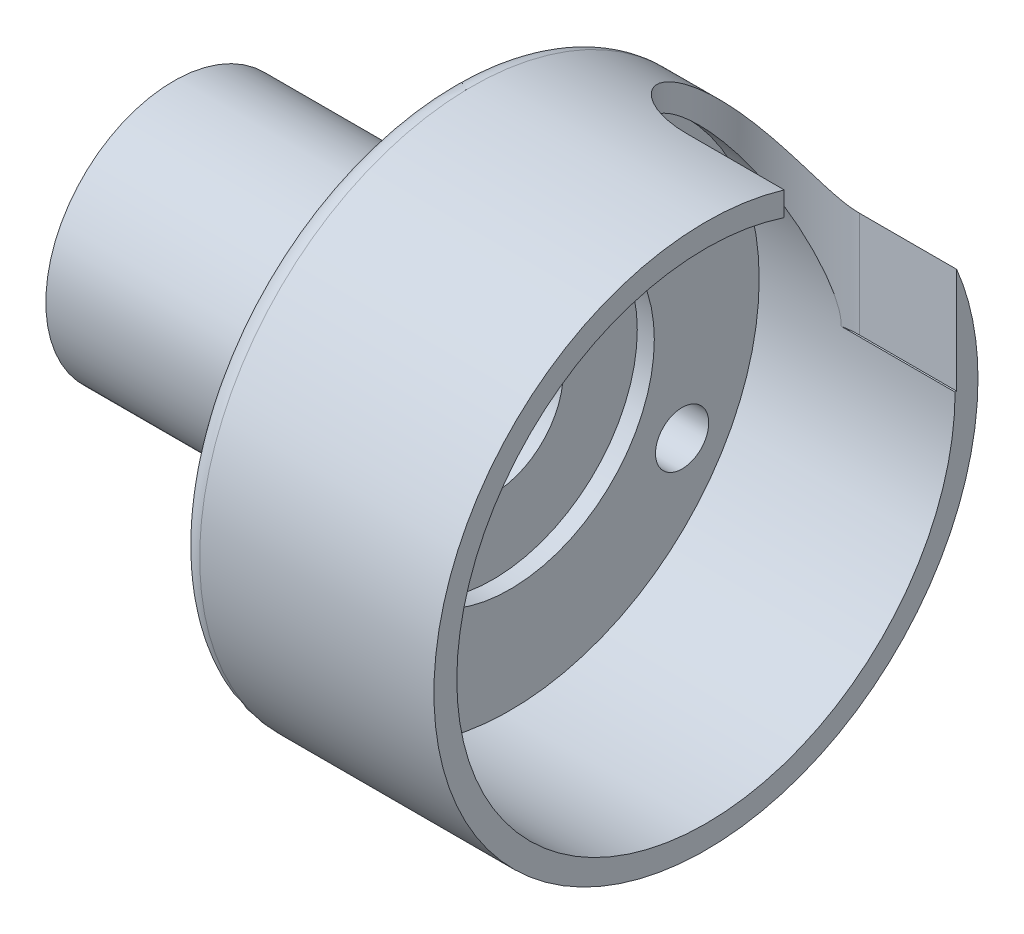
ISO-10303-21;
HEADER;
FILE_DESCRIPTION(('STEP AP214'),'2;1');
FILE_NAME('part.step','',(''),(''),'','','');
FILE_SCHEMA(('AUTOMOTIVE_DESIGN { 1 0 10303 214 1 1 1 1 }'));
ENDSEC;
DATA;
#1=APPLICATION_CONTEXT('core data for automotive mechanical design processes');
#2=APPLICATION_PROTOCOL_DEFINITION('international standard','automotive_design',2000,#1);
#3=PRODUCT_CONTEXT('',#1,'mechanical');
#4=PRODUCT('Part','Part','',(#3));
#5=PRODUCT_RELATED_PRODUCT_CATEGORY('part','',(#4));
#6=PRODUCT_DEFINITION_FORMATION('','',#4);
#7=PRODUCT_DEFINITION_CONTEXT('part definition',#1,'design');
#8=PRODUCT_DEFINITION('design','',#6,#7);
#9=PRODUCT_DEFINITION_SHAPE('','',#8);
#10=(LENGTH_UNIT() NAMED_UNIT(*) SI_UNIT(.MILLI.,.METRE.));
#11=(NAMED_UNIT(*) PLANE_ANGLE_UNIT() SI_UNIT($,.RADIAN.));
#12=(NAMED_UNIT(*) SI_UNIT($,.STERADIAN.) SOLID_ANGLE_UNIT());
#13=UNCERTAINTY_MEASURE_WITH_UNIT(LENGTH_MEASURE(1.E-05),#10,'distance_accuracy_value','');
#14=(GEOMETRIC_REPRESENTATION_CONTEXT(3) GLOBAL_UNCERTAINTY_ASSIGNED_CONTEXT((#13)) GLOBAL_UNIT_ASSIGNED_CONTEXT((#10,
#11,#12)) REPRESENTATION_CONTEXT('',''));
#15=CARTESIAN_POINT('',(0.,0.,0.));
#16=DIRECTION('',(0.,0.,1.));
#17=DIRECTION('',(1.,0.,0.));
#18=AXIS2_PLACEMENT_3D('',#15,#16,#17);
#19=CARTESIAN_POINT('',(-5.,0.,0.));
#20=DIRECTION('',(1.,0.,0.));
#21=DIRECTION('',(0.,0.,-1.));
#22=AXIS2_PLACEMENT_3D('',#19,#20,#21);
#23=CYLINDRICAL_SURFACE('',#22,3.3);
#24=CARTESIAN_POINT('',(10.,0.,0.));
#25=DIRECTION('',(1.,0.,0.));
#26=DIRECTION('',(0.,0.,-1.));
#27=AXIS2_PLACEMENT_3D('',#24,#25,#26);
#28=CIRCLE('',#27,3.3);
#29=CARTESIAN_POINT('',(10.,0.,-3.3));
#30=VERTEX_POINT('',#29);
#31=EDGE_CURVE('E255',#30,#30,#28,.T.);
#32=ORIENTED_EDGE('',*,*,#31,.T.);
#33=EDGE_LOOP('',(#32));
#34=FACE_BOUND('',#33,.T.);
#35=CARTESIAN_POINT('',(9.00000000000001,0.,0.));
#36=DIRECTION('',(-1.,0.,0.));
#37=DIRECTION('',(0.,0.,1.));
#38=AXIS2_PLACEMENT_3D('',#35,#36,#37);
#39=CIRCLE('',#38,3.3);
#40=CARTESIAN_POINT('',(9.00000000000001,0.,3.3));
#41=VERTEX_POINT('',#40);
#42=EDGE_CURVE('E69',#41,#41,#39,.F.);
#43=ORIENTED_EDGE('',*,*,#42,.F.);
#44=EDGE_LOOP('',(#43));
#45=FACE_BOUND('',#44,.T.);
#46=ADVANCED_FACE('F65',(#34,#45),#23,.F.);
#47=CARTESIAN_POINT('',(20.,0.,0.));
#48=DIRECTION('',(1.,0.,0.));
#49=DIRECTION('',(0.,0.,-1.));
#50=AXIS2_PLACEMENT_3D('',#47,#48,#49);
#51=PLANE('',#50);
#52=CARTESIAN_POINT('',(20.,0.,0.));
#53=DIRECTION('',(1.,0.,0.));
#54=DIRECTION('',(0.,0.,-1.));
#55=AXIS2_PLACEMENT_3D('',#52,#53,#54);
#56=CIRCLE('',#55,11.7);
#57=CARTESIAN_POINT('',(20.,11.1078519525604,-3.675));
#58=VERTEX_POINT('',#57);
#59=CARTESIAN_POINT('',(20.,0.,-11.7));
#60=VERTEX_POINT('',#59);
#61=EDGE_CURVE('E460',#58,#60,#56,.T.);
#62=ORIENTED_EDGE('',*,*,#61,.F.);
#63=DIRECTION('',(0.,-1.,0.));
#64=VECTOR('',#63,1.);
#65=CARTESIAN_POINT('',(20.,16.,-3.675));
#66=LINE('',#65,#64);
#67=CARTESIAN_POINT('',(20.,12.234990805064,-3.675));
#68=VERTEX_POINT('',#67);
#69=EDGE_CURVE('E135',#68,#58,#66,.T.);
#70=ORIENTED_EDGE('',*,*,#69,.F.);
#71=CARTESIAN_POINT('',(20.,0.,0.));
#72=DIRECTION('',(1.,0.,0.));
#73=DIRECTION('',(0.,0.,-1.));
#74=AXIS2_PLACEMENT_3D('',#71,#72,#73);
#75=CIRCLE('',#74,12.775);
#76=CARTESIAN_POINT('',(20.,4.954795656735,-11.775));
#77=VERTEX_POINT('',#76);
#78=EDGE_CURVE('E133',#68,#77,#75,.T.);
#79=ORIENTED_EDGE('',*,*,#78,.T.);
#80=DIRECTION('',(0.,-1.,0.));
#81=VECTOR('',#80,1.);
#82=CARTESIAN_POINT('',(20.,16.,-11.775));
#83=LINE('',#82,#81);
#84=CARTESIAN_POINT('',(20.,0.,-11.775));
#85=VERTEX_POINT('',#84);
#86=EDGE_CURVE('E125',#77,#85,#83,.T.);
#87=ORIENTED_EDGE('',*,*,#86,.T.);
#88=DIRECTION('',(0.,0.,1.));
#89=VECTOR('',#88,1.);
#90=CARTESIAN_POINT('',(20.,0.,-11.775));
#91=LINE('',#90,#89);
#92=EDGE_CURVE('E112',#85,#60,#91,.T.);
#93=ORIENTED_EDGE('',*,*,#92,.T.);
#94=EDGE_LOOP('',(#62,#70,#79,#87,#93));
#95=FACE_BOUND('',#94,.T.);
#96=ADVANCED_FACE('F130',(#95),#51,.T.);
#97=CARTESIAN_POINT('',(-22.2925973595304,0.,0.));
#98=DIRECTION('',(1.,0.,0.));
#99=DIRECTION('',(0.,0.,-1.));
#100=AXIS2_PLACEMENT_3D('',#97,#98,#99);
#101=CYLINDRICAL_SURFACE('',#100,11.7);
#102=CARTESIAN_POINT('',(10.8,0.,0.));
#103=DIRECTION('',(1.,0.,0.));
#104=DIRECTION('',(0.,0.,-1.));
#105=AXIS2_PLACEMENT_3D('',#102,#103,#104);
#106=CIRCLE('',#105,11.7);
#107=CARTESIAN_POINT('',(10.8,0.,-11.7));
#108=VERTEX_POINT('',#107);
#109=EDGE_CURVE('E462',#108,#108,#106,.F.);
#110=ORIENTED_EDGE('',*,*,#109,.T.);
#111=EDGE_LOOP('',(#110));
#112=FACE_BOUND('',#111,.T.);
#113=DIRECTION('',(1.,0.,0.));
#114=VECTOR('',#113,1.);
#115=CARTESIAN_POINT('',(-22.2925973595304,11.1078519525604,-3.675));
#116=LINE('',#115,#114);
#117=CARTESIAN_POINT('',(15.4300719305149,11.1078519525604,-3.675));
#118=VERTEX_POINT('',#117);
#119=EDGE_CURVE('E12',#58,#118,#116,.F.);
#120=ORIENTED_EDGE('',*,*,#119,.F.);
#121=ORIENTED_EDGE('',*,*,#61,.T.);
#122=DIRECTION('',(1.,0.,0.));
#123=VECTOR('',#122,1.);
#124=CARTESIAN_POINT('',(-22.2925973595304,0.,-11.7));
#125=LINE('',#124,#123);
#126=CARTESIAN_POINT('',(14.6542658980557,0.,-11.7));
#127=VERTEX_POINT('',#126);
#128=EDGE_CURVE('E117',#127,#60,#125,.T.);
#129=ORIENTED_EDGE('',*,*,#128,.F.);
#130=CARTESIAN_POINT('',(15.4300719305149,11.1078519525604,-3.675));
#131=CARTESIAN_POINT('',(15.321874357469,11.1078448137557,-3.67498552687792));
#132=CARTESIAN_POINT('',(15.2136782804234,11.1064172853442,-3.67933520948674));
#133=CARTESIAN_POINT('',(14.9980606494924,11.1006696657326,-3.69665890445622));
#134=CARTESIAN_POINT('',(14.8906390620478,11.0963497006348,-3.70963254083601));
#135=CARTESIAN_POINT('',(14.6774242912556,11.0847704243369,-3.74408532582627));
#136=CARTESIAN_POINT('',(14.5716297842871,11.0775136495638,-3.76555713449037));
#137=CARTESIAN_POINT('',(14.3623289609946,11.0599628707838,-3.81679957797082));
#138=CARTESIAN_POINT('',(14.2588226097493,11.049668913164,-3.84657008604012));
#139=CARTESIAN_POINT('',(14.0547931684851,11.0259147585262,-3.91413900220891));
#140=CARTESIAN_POINT('',(13.9542712375576,11.0124533489881,-3.95194048407501));
#141=CARTESIAN_POINT('',(13.7569264810491,10.9822151758271,-4.0352089751864));
#142=CARTESIAN_POINT('',(13.6601050264642,10.965437197383,-4.08067879235641));
#143=CARTESIAN_POINT('',(13.4709421983971,10.9284269946721,-4.17878309954883));
#144=CARTESIAN_POINT('',(13.3785976941289,10.9081972303655,-4.23141248183622));
#145=CARTESIAN_POINT('',(13.1989062753842,10.8641149774511,-4.34334239082116));
#146=CARTESIAN_POINT('',(13.1115612094694,10.8402611605978,-4.40264536136992));
#147=CARTESIAN_POINT('',(12.9423726209153,10.7887708307644,-4.52735884454252));
#148=CARTESIAN_POINT('',(12.8605353188507,10.7611301442932,-4.59277607002198));
#149=CARTESIAN_POINT('',(12.7029250624789,10.7019664310599,-4.72899872870154));
#150=CARTESIAN_POINT('',(12.6271543043419,10.6704420087244,-4.79980609527089));
#151=CARTESIAN_POINT('',(12.482118970827,10.6034547126697,-4.94602985375144));
#152=CARTESIAN_POINT('',(12.4128529538663,10.5679927154171,-5.02144521829218));
#153=CARTESIAN_POINT('',(12.2810741934953,10.4930870709412,-5.17614852903445));
#154=CARTESIAN_POINT('',(12.2185639855313,10.4536419395217,-5.25543791305136));
#155=CARTESIAN_POINT('',(12.0988340776575,10.3696272488956,-5.41936730125553));
#156=CARTESIAN_POINT('',(12.0418142838359,10.3249442200007,-5.50409523771966));
#157=CARTESIAN_POINT('',(11.9352006229624,10.231481696717,-5.67594740760889));
#158=CARTESIAN_POINT('',(11.8856094577103,10.1827007219203,-5.76307249931097));
#159=CARTESIAN_POINT('',(11.7479919389348,10.0304128845363,-6.02675993975707));
#160=CARTESIAN_POINT('',(11.6710341065358,9.92089946784347,-6.20575651932947));
#161=CARTESIAN_POINT('',(11.53921610847,9.67611794763069,-6.58163404240134));
#162=CARTESIAN_POINT('',(11.4872578914085,9.53937796679476,-6.7785498304953));
#163=CARTESIAN_POINT('',(11.4138077394232,9.25101562171613,-7.16709855321967));
#164=CARTESIAN_POINT('',(11.3923345402653,9.09938416647827,-7.35872816815356));
#165=CARTESIAN_POINT('',(11.3776043255917,8.81910089336532,-7.69088323482363));
#166=CARTESIAN_POINT('',(11.379124453972,8.69286147619829,-7.83327815203036));
#167=CARTESIAN_POINT('',(11.3961354997653,8.43398843227,-8.11134514872891));
#168=CARTESIAN_POINT('',(11.411632545795,8.30135202469889,-8.24701425154406));
#169=CARTESIAN_POINT('',(11.4548337419917,8.03040139340595,-8.5110832104586));
#170=CARTESIAN_POINT('',(11.4825651007312,7.89207514101251,-8.63946614007853));
#171=CARTESIAN_POINT('',(11.5485755572088,7.61085413971097,-8.88820294958323));
#172=CARTESIAN_POINT('',(11.5868545588686,7.46795943242737,-9.0085569025915));
#173=CARTESIAN_POINT('',(11.6922648875331,7.11135313798653,-9.2947484208774));
#174=CARTESIAN_POINT('',(11.7645568598733,6.89541200487178,-9.4559236479076));
#175=CARTESIAN_POINT('',(11.9246003485401,6.45688903981087,-9.76063319470439));
#176=CARTESIAN_POINT('',(12.0123595813919,6.23430393948547,-9.90415864813986));
#177=CARTESIAN_POINT('',(12.2000435751838,5.78391399409746,-10.1737505484756));
#178=CARTESIAN_POINT('',(12.2999647888715,5.55611068667703,-10.2998220632982));
#179=CARTESIAN_POINT('',(12.5092163718453,5.09621124956749,-10.534957449911));
#180=CARTESIAN_POINT('',(12.6185446722719,4.86411607254096,-10.6440250465372));
#181=CARTESIAN_POINT('',(12.8277125089724,4.43033637143341,-10.8309495438246));
#182=CARTESIAN_POINT('',(12.9266114998205,4.22915167930686,-10.9110384456941));
#183=CARTESIAN_POINT('',(13.1280007184286,3.82425218293121,-11.0594573665479));
#184=CARTESIAN_POINT('',(13.2304911087491,3.62053726442442,-11.1277868524259));
#185=CARTESIAN_POINT('',(13.4377113527418,3.2098726704605,-11.2531313742553));
#186=CARTESIAN_POINT('',(13.5424475670153,3.00291443440759,-11.3101076747649));
#187=CARTESIAN_POINT('',(13.751580027422,2.58608148099421,-11.412636979699));
#188=CARTESIAN_POINT('',(13.8559763679308,2.37620767713658,-11.458193480607));
#189=CARTESIAN_POINT('',(14.0163476692944,2.04379096285069,-11.5207603221632));
#190=CARTESIAN_POINT('',(14.0737703418485,1.92266038120232,-11.5416039116953));
#191=CARTESIAN_POINT('',(14.1859228431972,1.67859844764865,-11.5796186953345));
#192=CARTESIAN_POINT('',(14.2406531601851,1.55566742749431,-11.5967905571242));
#193=CARTESIAN_POINT('',(14.3448221704693,1.30849268850074,-11.6272613762697));
#194=CARTESIAN_POINT('',(14.3943068691404,1.18427311777827,-11.6405961397017));
#195=CARTESIAN_POINT('',(14.4849762527032,0.932561413433722,-11.6634595495844));
#196=CARTESIAN_POINT('',(14.5261714410956,0.805073654890283,-11.6729930278154));
#197=CARTESIAN_POINT('',(14.5889900223494,0.565989043937799,-11.6868145682267));
#198=CARTESIAN_POINT('',(14.612659380525,0.454999146570424,-11.6916873191988));
#199=CARTESIAN_POINT('',(14.6371821680639,0.286193464371981,-11.6966367778539));
#200=CARTESIAN_POINT('',(14.6435303246998,0.2292114866861,-11.6978935986054));
#201=CARTESIAN_POINT('',(14.6520978220564,0.114830471088762,-11.6995771020297));
#202=CARTESIAN_POINT('',(14.6543099801694,0.057430881106254,-11.7000023406291));
#203=CARTESIAN_POINT('',(14.6542658980557,0.,-11.7));
#204=B_SPLINE_CURVE_WITH_KNOTS('',3,(#130,#131,#132,#133,#134,#135,#136,#137,#138,#139,#140,
#141,#142,#143,#144,#145,#146,#147,#148,#149,#150,#151,#152,#153,#154,#155,#156,#157,#158,#159,
#160,#161,#162,#163,#164,#165,#166,#167,#168,#169,#170,#171,#172,#173,#174,#175,#176,#177,#178,
#179,#180,#181,#182,#183,#184,#185,#186,#187,#188,#189,#190,#191,#192,#193,#194,#195,#196,#197,
#198,#199,#200,#201,#202,#203),.UNSPECIFIED.,.F.,.F.,(4,2,2,2,2,2,2,2,2,2,2,2,2,2,2,2,2,2,2,2,2,
2,2,2,2,2,2,2,2,2,2,2,2,2,2,2,4),(0.,0.324493843286334,0.648973540454027,0.973173591110084,
1.29736869049004,1.62168809622833,1.94612651732118,2.27033468156188,2.59466195874875,
2.91934959476239,3.24415424553152,3.56888674227139,3.89374069055089,4.22779245409338,
4.56196541914957,5.22982968361078,5.96309567763883,6.69681213430079,7.26696933938862,
7.83737666934317,8.40905900564491,8.98073613466804,9.81641443947229,10.6525108455413,
11.4883639713546,12.3240337391983,13.0378648856676,13.751728384734,14.4679872805049,
15.1840266054581,15.5909520047519,15.9978033439639,16.4007249333238,16.8031327273289,
17.1430457162478,17.3149437241322,17.4871399751646),.UNSPECIFIED.);
#205=EDGE_CURVE('E75',#118,#127,#204,.T.);
#206=ORIENTED_EDGE('',*,*,#205,.F.);
#207=EDGE_LOOP('',(#120,#121,#129,#206));
#208=FACE_BOUND('',#207,.T.);
#209=ADVANCED_FACE('F182',(#112,#208),#101,.F.);
#210=CARTESIAN_POINT('',(10.,0.,0.));
#211=DIRECTION('',(1.,0.,0.));
#212=DIRECTION('',(0.,0.,-1.));
#213=AXIS2_PLACEMENT_3D('',#210,#211,#212);
#214=PLANE('',#213);
#215=ORIENTED_EDGE('',*,*,#31,.F.);
#216=EDGE_LOOP('',(#215));
#217=FACE_BOUND('',#216,.T.);
#218=CARTESIAN_POINT('',(10.,0.,0.));
#219=DIRECTION('',(1.,0.,0.));
#220=DIRECTION('',(0.,0.,-1.));
#221=AXIS2_PLACEMENT_3D('',#218,#219,#220);
#222=CIRCLE('',#221,6.775);
#223=CARTESIAN_POINT('',(10.,0.,-6.775));
#224=VERTEX_POINT('',#223);
#225=EDGE_CURVE('E262',#224,#224,#222,.T.);
#226=ORIENTED_EDGE('',*,*,#225,.T.);
#227=EDGE_LOOP('',(#226));
#228=FACE_BOUND('',#227,.T.);
#229=ADVANCED_FACE('F186',(#217,#228),#214,.T.);
#230=CARTESIAN_POINT('',(-5.,0.,0.));
#231=DIRECTION('',(1.,0.,0.));
#232=DIRECTION('',(0.,0.,-1.));
#233=AXIS2_PLACEMENT_3D('',#230,#231,#232);
#234=CYLINDRICAL_SURFACE('',#233,6.);
#235=CARTESIAN_POINT('',(-5.,0.,0.));
#236=DIRECTION('',(1.,0.,0.));
#237=DIRECTION('',(0.,0.,-1.));
#238=AXIS2_PLACEMENT_3D('',#235,#236,#237);
#239=CIRCLE('',#238,6.);
#240=CARTESIAN_POINT('',(-5.,0.,-6.));
#241=VERTEX_POINT('',#240);
#242=EDGE_CURVE('E249',#241,#241,#239,.T.);
#243=ORIENTED_EDGE('',*,*,#242,.T.);
#244=EDGE_LOOP('',(#243));
#245=FACE_BOUND('',#244,.T.);
#246=CARTESIAN_POINT('',(8.,0.,0.));
#247=DIRECTION('',(1.,0.,0.));
#248=DIRECTION('',(0.,0.,-1.));
#249=AXIS2_PLACEMENT_3D('',#246,#247,#248);
#250=CIRCLE('',#249,6.);
#251=CARTESIAN_POINT('',(8.,0.,-6.));
#252=VERTEX_POINT('',#251);
#253=EDGE_CURVE('E252',#252,#252,#250,.F.);
#254=ORIENTED_EDGE('',*,*,#253,.T.);
#255=EDGE_LOOP('',(#254));
#256=FACE_BOUND('',#255,.T.);
#257=ADVANCED_FACE('F238',(#245,#256),#234,.T.);
#258=CARTESIAN_POINT('',(-5.,0.,0.));
#259=DIRECTION('',(1.,0.,0.));
#260=DIRECTION('',(0.,0.,-1.));
#261=AXIS2_PLACEMENT_3D('',#258,#259,#260);
#262=PLANE('',#261);
#263=CARTESIAN_POINT('',(-5.,0.,0.));
#264=DIRECTION('',(-1.,0.,0.));
#265=DIRECTION('',(0.,0.,1.));
#266=AXIS2_PLACEMENT_3D('',#263,#264,#265);
#267=CIRCLE('',#266,4.5);
#268=CARTESIAN_POINT('',(-5.,0.,4.5));
#269=VERTEX_POINT('',#268);
#270=EDGE_CURVE('E447',#269,#269,#267,.T.);
#271=ORIENTED_EDGE('',*,*,#270,.F.);
#272=EDGE_LOOP('',(#271));
#273=FACE_BOUND('',#272,.T.);
#274=ORIENTED_EDGE('',*,*,#242,.F.);
#275=EDGE_LOOP('',(#274));
#276=FACE_BOUND('',#275,.T.);
#277=ADVANCED_FACE('F236',(#273,#276),#262,.F.);
#278=CARTESIAN_POINT('',(8.,0.,0.));
#279=DIRECTION('',(1.,0.,0.));
#280=DIRECTION('',(0.,0.,-1.));
#281=AXIS2_PLACEMENT_3D('',#278,#279,#280);
#282=PLANE('',#281);
#283=CARTESIAN_POINT('',(8.,0.,0.));
#284=DIRECTION('',(1.,0.,0.));
#285=DIRECTION('',(0.,0.,-1.));
#286=AXIS2_PLACEMENT_3D('',#283,#284,#285);
#287=CIRCLE('',#286,11.775);
#288=CARTESIAN_POINT('',(8.,0.,-11.775));
#289=VERTEX_POINT('',#288);
#290=EDGE_CURVE('E271',#289,#289,#287,.F.);
#291=ORIENTED_EDGE('',*,*,#290,.T.);
#292=EDGE_LOOP('',(#291));
#293=FACE_BOUND('',#292,.T.);
#294=ORIENTED_EDGE('',*,*,#253,.F.);
#295=EDGE_LOOP('',(#294));
#296=FACE_BOUND('',#295,.T.);
#297=ADVANCED_FACE('F223',(#293,#296),#282,.F.);
#298=CARTESIAN_POINT('',(8.,0.,0.));
#299=DIRECTION('',(1.,0.,0.));
#300=DIRECTION('',(0.,0.,-1.));
#301=AXIS2_PLACEMENT_3D('',#298,#299,#300);
#302=CYLINDRICAL_SURFACE('',#301,12.775);
#303=DIRECTION('',(1.,0.,0.));
#304=VECTOR('',#303,1.);
#305=CARTESIAN_POINT('',(8.00000000000001,4.95479565673499,-11.775));
#306=LINE('',#305,#304);
#307=CARTESIAN_POINT('',(15.4300719305149,4.954795656735,-11.775));
#308=VERTEX_POINT('',#307);
#309=EDGE_CURVE('E90',#77,#308,#306,.F.);
#310=ORIENTED_EDGE('',*,*,#309,.F.);
#311=ORIENTED_EDGE('',*,*,#78,.F.);
#312=DIRECTION('',(1.,0.,0.));
#313=VECTOR('',#312,1.);
#314=CARTESIAN_POINT('',(8.,12.234990805064,-3.675));
#315=LINE('',#314,#313);
#316=CARTESIAN_POINT('',(15.4300719305149,12.234990805064,-3.675));
#317=VERTEX_POINT('',#316);
#318=EDGE_CURVE('E144',#68,#317,#315,.F.);
#319=ORIENTED_EDGE('',*,*,#318,.T.);
#320=CARTESIAN_POINT('',(15.4300719305149,12.234990805064,-3.675));
#321=CARTESIAN_POINT('',(15.3209331471853,12.234984045307,-3.67498583358514));
#322=CARTESIAN_POINT('',(15.2117959017638,12.2336655392509,-3.67941098492061));
#323=CARTESIAN_POINT('',(14.9943026022523,12.2283560286608,-3.6970380817084));
#324=CARTESIAN_POINT('',(14.8859465137105,12.2243651427261,-3.71023963766665));
#325=CARTESIAN_POINT('',(14.6708744450499,12.2136663827676,-3.74530294439951));
#326=CARTESIAN_POINT('',(14.5641571602142,12.2069608003351,-3.76715739055855));
#327=CARTESIAN_POINT('',(14.3530300604128,12.1907398060429,-3.81932434510254));
#328=CARTESIAN_POINT('',(14.2486202113645,12.1812244357158,-3.84963672846712));
#329=CARTESIAN_POINT('',(14.0428106007343,12.1592613741932,-3.91845509230125));
#330=CARTESIAN_POINT('',(13.9414119614849,12.1468126047366,-3.95696408518206));
#331=CARTESIAN_POINT('',(13.7423456042829,12.1188400980153,-4.04182325481384));
#332=CARTESIAN_POINT('',(13.6446792702618,12.1033152330875,-4.08817630619919));
#333=CARTESIAN_POINT('',(13.4538650465589,12.0690555467578,-4.18823540936472));
#334=CARTESIAN_POINT('',(13.360714098302,12.0503229382914,-4.2419363869115));
#335=CARTESIAN_POINT('',(13.1794593939029,12.0094843365914,-4.3562130591165));
#336=CARTESIAN_POINT('',(13.0913575059105,11.9873771056921,-4.41679127395061));
#337=CARTESIAN_POINT('',(12.9207282347335,11.9396346189753,-4.54426948513484));
#338=CARTESIAN_POINT('',(12.8382064268129,11.9139959101703,-4.61117564847631));
#339=CARTESIAN_POINT('',(12.6793057666344,11.8590847958972,-4.7506155126085));
#340=CARTESIAN_POINT('',(12.6029291445904,11.8298110809262,-4.82315123788722));
#341=CARTESIAN_POINT('',(12.4567845467253,11.7675657920641,-4.973088079405));
#342=CARTESIAN_POINT('',(12.3870150295869,11.7345950845533,-5.05048805385937));
#343=CARTESIAN_POINT('',(12.2543585137771,11.6649021977637,-5.20943528589755));
#344=CARTESIAN_POINT('',(12.1914740961368,11.6281786215456,-5.29098408209374));
#345=CARTESIAN_POINT('',(12.0713730234259,11.5500466590375,-5.45947532311347));
#346=CARTESIAN_POINT('',(12.014333535773,11.5085453534969,-5.546501051891));
#347=CARTESIAN_POINT('',(11.9078385070497,11.4216833550459,-5.72324213042907));
#348=CARTESIAN_POINT('',(11.8583857280252,11.3763212658645,-5.81295844559107));
#349=CARTESIAN_POINT('',(11.7214901506864,11.2346130513023,-6.08487313734174));
#350=CARTESIAN_POINT('',(11.6454183511347,11.1325851455843,-6.26996819588885));
#351=CARTESIAN_POINT('',(11.5174798087419,10.9055873035184,-6.6575917226026));
#352=CARTESIAN_POINT('',(11.468243573072,10.7794009557001,-6.8602557924575));
#353=CARTESIAN_POINT('',(11.401515195475,10.5131644130104,-7.26168316940139));
#354=CARTESIAN_POINT('',(11.3840406347638,10.3731065849813,-7.46044425587755));
#355=CARTESIAN_POINT('',(11.378210474965,10.1207210597664,-7.7976575551745));
#356=CARTESIAN_POINT('',(11.3833174136111,10.0109941143611,-7.93802315881763));
#357=CARTESIAN_POINT('',(11.4072529069467,9.78633642357235,-8.21339174999015));
#358=CARTESIAN_POINT('',(11.4260865019618,9.67140378123861,-8.34839274846963));
#359=CARTESIAN_POINT('',(11.4762155729429,9.4370000355987,-8.61248587842028));
#360=CARTESIAN_POINT('',(11.507538433729,9.31751948446168,-8.74156432554272));
#361=CARTESIAN_POINT('',(11.5814568660812,9.07507698517779,-8.99300347592304));
#362=CARTESIAN_POINT('',(11.6240522446071,8.9521150966805,-9.11536429417596));
#363=CARTESIAN_POINT('',(11.7333042778936,8.66752007182856,-9.38743051651246));
#364=CARTESIAN_POINT('',(11.8033571173605,8.5049758916596,-9.53482544044959));
#365=CARTESIAN_POINT('',(11.9588699531055,8.17683730991072,-9.81768365604331));
#366=CARTESIAN_POINT('',(12.0443365093991,8.01124163667383,-9.95314183078553));
#367=CARTESIAN_POINT('',(12.2295722809001,7.67869355822805,-10.2118881365886));
#368=CARTESIAN_POINT('',(12.3293362201354,7.51174167482707,-10.3351807287378));
#369=CARTESIAN_POINT('',(12.5427964751371,7.17825942440535,-10.5695165367571));
#370=CARTESIAN_POINT('',(12.6564857913163,7.01172888821101,-10.6805658538013));
#371=CARTESIAN_POINT('',(12.8457503706469,6.75332492787889,-10.8446052628927));
#372=CARTESIAN_POINT('',(12.9163889420661,6.66049137888795,-10.9018356266862));
#373=CARTESIAN_POINT('',(13.0625960991297,6.47631717665458,-11.0122411501771));
#374=CARTESIAN_POINT('',(13.1381638186771,6.38497626465025,-11.0654170187446));
#375=CARTESIAN_POINT('',(13.2945929946802,6.20466157606615,-11.1675206877688));
#376=CARTESIAN_POINT('',(13.3754486845392,6.11568536494685,-11.2164529847355));
#377=CARTESIAN_POINT('',(13.543161823836,5.94115398452398,-11.3098677295087));
#378=CARTESIAN_POINT('',(13.6300171344399,5.85559761306146,-11.3543517494017));
#379=CARTESIAN_POINT('',(13.8315307506619,5.67030139941646,-11.4482050961358));
#380=CARTESIAN_POINT('',(13.9479778010477,5.57184861721592,-11.4963304113132));
#381=CARTESIAN_POINT('',(14.19366667207,5.38750563411852,-11.583857078148));
#382=CARTESIAN_POINT('',(14.3228938122503,5.30160129360151,-11.6232682750371));
#383=CARTESIAN_POINT('',(14.5509053957978,5.17610011278596,-11.6795420262578));
#384=CARTESIAN_POINT('',(14.6456021728681,5.130588395309,-11.6995498687435));
#385=CARTESIAN_POINT('',(14.8412768071027,5.05318192210733,-11.7331905189939));
#386=CARTESIAN_POINT('',(14.9422268722079,5.02123126252115,-11.7468495217166));
#387=CARTESIAN_POINT('',(15.108212055431,4.98399382671327,-11.7626815586283));
#388=CARTESIAN_POINT('',(15.1717861577596,4.97316346953424,-11.7672586799353));
#389=CARTESIAN_POINT('',(15.3002329304008,4.95850995909073,-11.773437197962));
#390=CARTESIAN_POINT('',(15.365110893683,4.95472656462886,-11.7750217111524));
#391=CARTESIAN_POINT('',(15.4300719305149,4.954795656735,-11.775));
#392=B_SPLINE_CURVE_WITH_KNOTS('',3,(#320,#321,#322,#323,#324,#325,#326,#327,#328,#329,#330,
#331,#332,#333,#334,#335,#336,#337,#338,#339,#340,#341,#342,#343,#344,#345,#346,#347,#348,#349,
#350,#351,#352,#353,#354,#355,#356,#357,#358,#359,#360,#361,#362,#363,#364,#365,#366,#367,#368,
#369,#370,#371,#372,#373,#374,#375,#376,#377,#378,#379,#380,#381,#382,#383,#384,#385,#386,#387,
#388,#389,#390,#391),.UNSPECIFIED.,.F.,.F.,(4,2,2,2,2,2,2,2,2,2,2,2,2,2,2,2,2,2,2,2,2,2,2,2,2,2,
2,2,2,2,2,2,2,2,2,4),(0.,0.327316582137119,0.65461863903743,0.981644980487314,1.30866648827772,
1.63580839091195,1.96307044283359,2.29010762844273,2.61726504662847,2.9447446521589,
3.27234257563037,3.59986388722843,3.92750756004008,4.2631994968459,4.59901335837471,
5.27013460340023,5.99872453618325,6.72771764670937,7.26175841344123,7.79599537481126,
8.33141023987086,8.8668159366265,9.55687198516535,10.2472224148196,10.9373187465337,
11.6270696141186,12.0167397855116,12.4063416717194,12.7955255569726,13.1845714091665,
13.6634571904775,14.1417991290579,14.4617583003722,14.7803853561272,14.9739098026567,
15.1685228405213),.UNSPECIFIED.);
#393=EDGE_CURVE('E148',#317,#308,#392,.T.);
#394=ORIENTED_EDGE('',*,*,#393,.T.);
#395=EDGE_LOOP('',(#310,#311,#319,#394));
#396=FACE_BOUND('',#395,.T.);
#397=CARTESIAN_POINT('',(9.,0.,0.));
#398=DIRECTION('',(1.,0.,0.));
#399=DIRECTION('',(0.,0.,-1.));
#400=AXIS2_PLACEMENT_3D('',#397,#398,#399);
#401=CIRCLE('',#400,12.775);
#402=CARTESIAN_POINT('',(9.,0.,-12.775));
#403=VERTEX_POINT('',#402);
#404=EDGE_CURVE('E268',#403,#403,#401,.T.);
#405=ORIENTED_EDGE('',*,*,#404,.T.);
#406=EDGE_LOOP('',(#405));
#407=FACE_BOUND('',#406,.T.);
#408=ADVANCED_FACE('F159',(#396,#407),#302,.T.);
#409=CARTESIAN_POINT('',(10.8,0.,0.));
#410=DIRECTION('',(1.,0.,0.));
#411=DIRECTION('',(0.,0.,-1.));
#412=AXIS2_PLACEMENT_3D('',#409,#410,#411);
#413=PLANE('',#412);
#414=CARTESIAN_POINT('',(10.8,9.33000000000001,0.));
#415=DIRECTION('',(1.,0.,0.));
#416=DIRECTION('',(0.,0.,-1.));
#417=AXIS2_PLACEMENT_3D('',#414,#415,#416);
#418=CIRCLE('',#417,1.25);
#419=CARTESIAN_POINT('',(10.8,9.33000000000001,-1.25));
#420=VERTEX_POINT('',#419);
#421=EDGE_CURVE('E475',#420,#420,#418,.T.);
#422=ORIENTED_EDGE('',*,*,#421,.F.);
#423=EDGE_LOOP('',(#422));
#424=FACE_BOUND('',#423,.T.);
#425=CARTESIAN_POINT('',(10.8,-4.66500000000001,-8.08001701730883));
#426=DIRECTION('',(1.,0.,0.));
#427=DIRECTION('',(0.,0.,-1.));
#428=AXIS2_PLACEMENT_3D('',#425,#426,#427);
#429=CIRCLE('',#428,1.25);
#430=CARTESIAN_POINT('',(10.8,-4.66500000000001,-9.33001701730883));
#431=VERTEX_POINT('',#430);
#432=EDGE_CURVE('E479',#431,#431,#429,.T.);
#433=ORIENTED_EDGE('',*,*,#432,.F.);
#434=EDGE_LOOP('',(#433));
#435=FACE_BOUND('',#434,.T.);
#436=CARTESIAN_POINT('',(10.8,-4.66500000000001,8.08001701730882));
#437=DIRECTION('',(1.,0.,0.));
#438=DIRECTION('',(0.,0.,-1.));
#439=AXIS2_PLACEMENT_3D('',#436,#437,#438);
#440=CIRCLE('',#439,1.25);
#441=CARTESIAN_POINT('',(10.8,-4.66500000000001,6.83001701730882));
#442=VERTEX_POINT('',#441);
#443=EDGE_CURVE('E487',#442,#442,#440,.T.);
#444=ORIENTED_EDGE('',*,*,#443,.F.);
#445=EDGE_LOOP('',(#444));
#446=FACE_BOUND('',#445,.T.);
#447=CARTESIAN_POINT('',(10.8,0.,0.));
#448=DIRECTION('',(1.,0.,0.));
#449=DIRECTION('',(0.,0.,-1.));
#450=AXIS2_PLACEMENT_3D('',#447,#448,#449);
#451=CIRCLE('',#450,6.775);
#452=CARTESIAN_POINT('',(10.8,0.,-6.775));
#453=VERTEX_POINT('',#452);
#454=EDGE_CURVE('E256',#453,#453,#451,.T.);
#455=ORIENTED_EDGE('',*,*,#454,.F.);
#456=EDGE_LOOP('',(#455));
#457=FACE_BOUND('',#456,.T.);
#458=ORIENTED_EDGE('',*,*,#109,.F.);
#459=EDGE_LOOP('',(#458));
#460=FACE_BOUND('',#459,.T.);
#461=ADVANCED_FACE('F216',(#424,#435,#446,#457,#460),#413,.T.);
#462=CARTESIAN_POINT('',(10.8,0.,0.));
#463=DIRECTION('',(-1.,0.,0.));
#464=DIRECTION('',(0.,0.,1.));
#465=AXIS2_PLACEMENT_3D('',#462,#463,#464);
#466=CYLINDRICAL_SURFACE('',#465,6.775);
#467=ORIENTED_EDGE('',*,*,#454,.T.);
#468=EDGE_LOOP('',(#467));
#469=FACE_BOUND('',#468,.T.);
#470=ORIENTED_EDGE('',*,*,#225,.F.);
#471=EDGE_LOOP('',(#470));
#472=FACE_BOUND('',#471,.T.);
#473=ADVANCED_FACE('F210',(#469,#472),#466,.F.);
#474=CARTESIAN_POINT('',(8.05,-4.66500000000001,8.08001701730882));
#475=DIRECTION('',(1.,0.,0.));
#476=DIRECTION('',(0.,0.,-1.));
#477=AXIS2_PLACEMENT_3D('',#474,#475,#476);
#478=CYLINDRICAL_SURFACE('',#477,1.25);
#479=CARTESIAN_POINT('',(8.05,-4.66500000000001,8.08001701730882));
#480=DIRECTION('',(1.,0.,0.));
#481=DIRECTION('',(0.,0.,-1.));
#482=AXIS2_PLACEMENT_3D('',#479,#480,#481);
#483=CIRCLE('',#482,1.25);
#484=CARTESIAN_POINT('',(8.05,-4.66500000000001,6.83001701730882));
#485=VERTEX_POINT('',#484);
#486=EDGE_CURVE('E470',#485,#485,#483,.T.);
#487=ORIENTED_EDGE('',*,*,#486,.F.);
#488=EDGE_LOOP('',(#487));
#489=FACE_BOUND('',#488,.T.);
#490=ORIENTED_EDGE('',*,*,#443,.T.);
#491=EDGE_LOOP('',(#490));
#492=FACE_BOUND('',#491,.T.);
#493=ADVANCED_FACE('F207',(#489,#492),#478,.F.);
#494=CARTESIAN_POINT('',(8.05,-4.66500000000001,8.08001701730882));
#495=DIRECTION('',(1.,0.,0.));
#496=DIRECTION('',(0.,0.,-1.));
#497=AXIS2_PLACEMENT_3D('',#494,#495,#496);
#498=PLANE('',#497);
#499=ORIENTED_EDGE('',*,*,#486,.T.);
#500=EDGE_LOOP('',(#499));
#501=FACE_BOUND('',#500,.T.);
#502=ADVANCED_FACE('F202',(#501),#498,.T.);
#503=CARTESIAN_POINT('',(8.05,-4.66500000000001,-8.08001701730883));
#504=DIRECTION('',(1.,0.,0.));
#505=DIRECTION('',(0.,0.,-1.));
#506=AXIS2_PLACEMENT_3D('',#503,#504,#505);
#507=CYLINDRICAL_SURFACE('',#506,1.25);
#508=CARTESIAN_POINT('',(8.05,-4.66500000000001,-8.08001701730883));
#509=DIRECTION('',(1.,0.,0.));
#510=DIRECTION('',(0.,0.,-1.));
#511=AXIS2_PLACEMENT_3D('',#508,#509,#510);
#512=CIRCLE('',#511,1.25);
#513=CARTESIAN_POINT('',(8.05,-4.66500000000001,-9.33001701730883));
#514=VERTEX_POINT('',#513);
#515=EDGE_CURVE('E483',#514,#514,#512,.T.);
#516=ORIENTED_EDGE('',*,*,#515,.F.);
#517=EDGE_LOOP('',(#516));
#518=FACE_BOUND('',#517,.T.);
#519=ORIENTED_EDGE('',*,*,#432,.T.);
#520=EDGE_LOOP('',(#519));
#521=FACE_BOUND('',#520,.T.);
#522=ADVANCED_FACE('F199',(#518,#521),#507,.F.);
#523=CARTESIAN_POINT('',(8.05,0.,0.));
#524=DIRECTION('',(1.,0.,0.));
#525=DIRECTION('',(0.,0.,-1.));
#526=AXIS2_PLACEMENT_3D('',#523,#524,#525);
#527=PLANE('',#526);
#528=ORIENTED_EDGE('',*,*,#515,.T.);
#529=EDGE_LOOP('',(#528));
#530=FACE_BOUND('',#529,.T.);
#531=ADVANCED_FACE('F197',(#530),#527,.T.);
#532=CARTESIAN_POINT('',(8.05,9.33000000000001,0.));
#533=DIRECTION('',(1.,0.,0.));
#534=DIRECTION('',(0.,0.,-1.));
#535=AXIS2_PLACEMENT_3D('',#532,#533,#534);
#536=CYLINDRICAL_SURFACE('',#535,1.25);
#537=CARTESIAN_POINT('',(8.05,9.33000000000001,0.));
#538=DIRECTION('',(1.,0.,0.));
#539=DIRECTION('',(0.,0.,-1.));
#540=AXIS2_PLACEMENT_3D('',#537,#538,#539);
#541=CIRCLE('',#540,1.25);
#542=CARTESIAN_POINT('',(8.05,9.33000000000001,-1.25));
#543=VERTEX_POINT('',#542);
#544=EDGE_CURVE('E471',#543,#543,#541,.T.);
#545=ORIENTED_EDGE('',*,*,#544,.F.);
#546=EDGE_LOOP('',(#545));
#547=FACE_BOUND('',#546,.T.);
#548=ORIENTED_EDGE('',*,*,#421,.T.);
#549=EDGE_LOOP('',(#548));
#550=FACE_BOUND('',#549,.T.);
#551=ADVANCED_FACE('F193',(#547,#550),#536,.F.);
#552=CARTESIAN_POINT('',(8.05,0.,0.));
#553=DIRECTION('',(1.,0.,0.));
#554=DIRECTION('',(0.,0.,-1.));
#555=AXIS2_PLACEMENT_3D('',#552,#553,#554);
#556=PLANE('',#555);
#557=ORIENTED_EDGE('',*,*,#544,.T.);
#558=EDGE_LOOP('',(#557));
#559=FACE_BOUND('',#558,.T.);
#560=ADVANCED_FACE('F190',(#559),#556,.T.);
#561=CARTESIAN_POINT('',(9.,0.,0.));
#562=DIRECTION('',(1.,0.,0.));
#563=DIRECTION('',(0.,0.,-1.));
#564=AXIS2_PLACEMENT_3D('',#561,#562,#563);
#565=TOROIDAL_SURFACE('',#564,11.775,1.);
#566=ORIENTED_EDGE('',*,*,#290,.F.);
#567=EDGE_LOOP('',(#566));
#568=FACE_BOUND('',#567,.T.);
#569=ORIENTED_EDGE('',*,*,#404,.F.);
#570=EDGE_LOOP('',(#569));
#571=FACE_BOUND('',#570,.T.);
#572=ADVANCED_FACE('F67',(#568,#571),#565,.T.);
#573=CARTESIAN_POINT('',(15.4300719305149,16.,-7.725));
#574=DIRECTION('',(0.,-1.,0.));
#575=DIRECTION('',(0.,0.,-1.));
#576=AXIS2_PLACEMENT_3D('',#573,#574,#575);
#577=CYLINDRICAL_SURFACE('',#576,4.05);
#578=DIRECTION('',(0.,-1.,0.));
#579=VECTOR('',#578,1.);
#580=CARTESIAN_POINT('',(15.4300719305149,16.,-3.675));
#581=LINE('',#580,#579);
#582=EDGE_CURVE('E139',#317,#118,#581,.T.);
#583=ORIENTED_EDGE('',*,*,#582,.T.);
#584=ORIENTED_EDGE('',*,*,#205,.T.);
#585=CARTESIAN_POINT('',(15.4300719305149,0.,-7.725));
#586=DIRECTION('',(0.,1.,0.));
#587=DIRECTION('',(0.,0.,1.));
#588=AXIS2_PLACEMENT_3D('',#585,#586,#587);
#589=CIRCLE('',#588,4.05);
#590=CARTESIAN_POINT('',(15.4300719305149,0.,-11.775));
#591=VERTEX_POINT('',#590);
#592=EDGE_CURVE('E82',#591,#127,#589,.T.);
#593=ORIENTED_EDGE('',*,*,#592,.F.);
#594=DIRECTION('',(0.,-1.,0.));
#595=VECTOR('',#594,1.);
#596=CARTESIAN_POINT('',(15.4300719305149,16.,-11.775));
#597=LINE('',#596,#595);
#598=EDGE_CURVE('E126',#308,#591,#597,.T.);
#599=ORIENTED_EDGE('',*,*,#598,.F.);
#600=ORIENTED_EDGE('',*,*,#393,.F.);
#601=EDGE_LOOP('',(#583,#584,#593,#599,#600));
#602=FACE_BOUND('',#601,.T.);
#603=ADVANCED_FACE('F163',(#602),#577,.F.);
#604=CARTESIAN_POINT('',(15.4300719305149,16.,-3.675));
#605=DIRECTION('',(0.,0.,-1.));
#606=DIRECTION('',(-1.,0.,0.));
#607=AXIS2_PLACEMENT_3D('',#604,#605,#606);
#608=PLANE('',#607);
#609=ORIENTED_EDGE('',*,*,#69,.T.);
#610=ORIENTED_EDGE('',*,*,#119,.T.);
#611=ORIENTED_EDGE('',*,*,#582,.F.);
#612=ORIENTED_EDGE('',*,*,#318,.F.);
#613=EDGE_LOOP('',(#609,#610,#611,#612));
#614=FACE_BOUND('',#613,.T.);
#615=ADVANCED_FACE('F168',(#614),#608,.T.);
#616=CARTESIAN_POINT('',(15.4300719305149,0.,-7.725));
#617=DIRECTION('',(0.,1.,0.));
#618=DIRECTION('',(0.,0.,1.));
#619=AXIS2_PLACEMENT_3D('',#616,#617,#618);
#620=PLANE('',#619);
#621=ORIENTED_EDGE('',*,*,#128,.T.);
#622=ORIENTED_EDGE('',*,*,#92,.F.);
#623=DIRECTION('',(1.,0.,0.));
#624=VECTOR('',#623,1.);
#625=CARTESIAN_POINT('',(15.4300719305149,0.,-11.775));
#626=LINE('',#625,#624);
#627=EDGE_CURVE('E115',#591,#85,#626,.T.);
#628=ORIENTED_EDGE('',*,*,#627,.F.);
#629=ORIENTED_EDGE('',*,*,#592,.T.);
#630=EDGE_LOOP('',(#621,#622,#628,#629));
#631=FACE_BOUND('',#630,.T.);
#632=ADVANCED_FACE('F114',(#631),#620,.T.);
#633=CARTESIAN_POINT('',(15.4300719305149,16.,-11.775));
#634=DIRECTION('',(0.,0.,-1.));
#635=DIRECTION('',(-1.,0.,0.));
#636=AXIS2_PLACEMENT_3D('',#633,#634,#635);
#637=PLANE('',#636);
#638=ORIENTED_EDGE('',*,*,#309,.T.);
#639=ORIENTED_EDGE('',*,*,#598,.T.);
#640=ORIENTED_EDGE('',*,*,#627,.T.);
#641=ORIENTED_EDGE('',*,*,#86,.F.);
#642=EDGE_LOOP('',(#638,#639,#640,#641));
#643=FACE_BOUND('',#642,.T.);
#644=ADVANCED_FACE('F124',(#643),#637,.F.);
#645=CARTESIAN_POINT('',(9.00000000000001,0.,0.));
#646=DIRECTION('',(-1.,0.,0.));
#647=DIRECTION('',(0.,0.,1.));
#648=AXIS2_PLACEMENT_3D('',#645,#646,#647);
#649=PLANE('',#648);
#650=CARTESIAN_POINT('',(9.00000000000001,0.,0.));
#651=DIRECTION('',(-1.,0.,0.));
#652=DIRECTION('',(0.,0.,1.));
#653=AXIS2_PLACEMENT_3D('',#650,#651,#652);
#654=CIRCLE('',#653,4.5);
#655=CARTESIAN_POINT('',(9.00000000000001,0.,4.5));
#656=VERTEX_POINT('',#655);
#657=EDGE_CURVE('E444',#656,#656,#654,.T.);
#658=ORIENTED_EDGE('',*,*,#657,.T.);
#659=EDGE_LOOP('',(#658));
#660=FACE_BOUND('',#659,.T.);
#661=ORIENTED_EDGE('',*,*,#42,.T.);
#662=EDGE_LOOP('',(#661));
#663=FACE_BOUND('',#662,.T.);
#664=ADVANCED_FACE('F309',(#660,#663),#649,.T.);
#665=CARTESIAN_POINT('',(9.00000000000001,0.,0.));
#666=DIRECTION('',(-1.,0.,0.));
#667=DIRECTION('',(0.,0.,1.));
#668=AXIS2_PLACEMENT_3D('',#665,#666,#667);
#669=CYLINDRICAL_SURFACE('',#668,4.5);
#670=ORIENTED_EDGE('',*,*,#657,.F.);
#671=EDGE_LOOP('',(#670));
#672=FACE_BOUND('',#671,.T.);
#673=ORIENTED_EDGE('',*,*,#270,.T.);
#674=EDGE_LOOP('',(#673));
#675=FACE_BOUND('',#674,.T.);
#676=ADVANCED_FACE('F315',(#672,#675),#669,.F.);
#677=CLOSED_SHELL('',(#46,#96,#209,#229,#257,#277,#297,#408,#461,#473,#493,#502,#522,#531,#551,
#560,#572,#603,#615,#632,#644,#664,#676));
#678=MANIFOLD_SOLID_BREP('B2',#677);
#679=ADVANCED_BREP_SHAPE_REPRESENTATION('',(#18,#678),#14);
#680=SHAPE_DEFINITION_REPRESENTATION(#9,#679);
ENDSEC;
END-ISO-10303-21;
